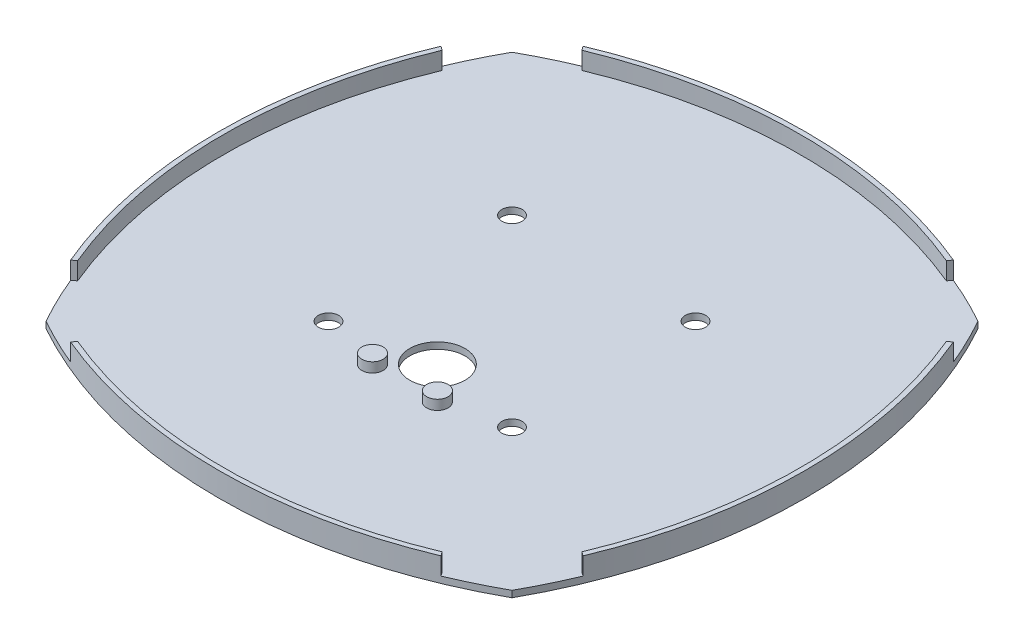
ISO-10303-21;
HEADER;
FILE_DESCRIPTION(('STEP AP214'),'2;1');
FILE_NAME('part.step','',(''),(''),'','','');
FILE_SCHEMA(('AUTOMOTIVE_DESIGN { 1 0 10303 214 1 1 1 1 }'));
ENDSEC;
DATA;
#1=APPLICATION_CONTEXT('core data for automotive mechanical design processes');
#2=APPLICATION_PROTOCOL_DEFINITION('international standard','automotive_design',2000,#1);
#3=PRODUCT_CONTEXT('',#1,'mechanical');
#4=PRODUCT('Part','Part','',(#3));
#5=PRODUCT_RELATED_PRODUCT_CATEGORY('part','',(#4));
#6=PRODUCT_DEFINITION_FORMATION('','',#4);
#7=PRODUCT_DEFINITION_CONTEXT('part definition',#1,'design');
#8=PRODUCT_DEFINITION('design','',#6,#7);
#9=PRODUCT_DEFINITION_SHAPE('','',#8);
#10=(LENGTH_UNIT() NAMED_UNIT(*) SI_UNIT(.MILLI.,.METRE.));
#11=(NAMED_UNIT(*) PLANE_ANGLE_UNIT() SI_UNIT($,.RADIAN.));
#12=(NAMED_UNIT(*) SI_UNIT($,.STERADIAN.) SOLID_ANGLE_UNIT());
#13=UNCERTAINTY_MEASURE_WITH_UNIT(LENGTH_MEASURE(1.E-05),#10,'distance_accuracy_value','');
#14=(GEOMETRIC_REPRESENTATION_CONTEXT(3) GLOBAL_UNCERTAINTY_ASSIGNED_CONTEXT((#13)) GLOBAL_UNIT_ASSIGNED_CONTEXT((#10,
#11,#12)) REPRESENTATION_CONTEXT('',''));
#15=CARTESIAN_POINT('',(0.,0.,0.));
#16=DIRECTION('',(0.,0.,1.));
#17=DIRECTION('',(1.,0.,0.));
#18=AXIS2_PLACEMENT_3D('',#15,#16,#17);
#19=CARTESIAN_POINT('',(170.576368521805,2.,81.6560053184627));
#20=DIRECTION('',(0.,1.,0.));
#21=DIRECTION('',(0.,0.,1.));
#22=AXIS2_PLACEMENT_3D('',#19,#20,#21);
#23=PLANE('',#22);
#24=CARTESIAN_POINT('',(209.331937645936,2.,85.9004361943316));
#25=DIRECTION('',(0.,1.,0.));
#26=DIRECTION('',(0.,0.,1.));
#27=AXIS2_PLACEMENT_3D('',#24,#25,#26);
#28=CIRCLE('',#27,3.28947250591846);
#29=CARTESIAN_POINT('',(209.331937645936,2.,89.1899087002501));
#30=VERTEX_POINT('',#29);
#31=EDGE_CURVE('E661',#30,#30,#28,.T.);
#32=ORIENTED_EDGE('',*,*,#31,.F.);
#33=EDGE_LOOP('',(#32));
#34=FACE_BOUND('',#33,.T.);
#35=CARTESIAN_POINT('',(189.331937645936,2.,85.9004361943316));
#36=DIRECTION('',(0.,1.,0.));
#37=DIRECTION('',(0.,0.,1.));
#38=AXIS2_PLACEMENT_3D('',#35,#36,#37);
#39=CIRCLE('',#38,3.28947250591846);
#40=CARTESIAN_POINT('',(189.331937645936,2.,89.1899087002501));
#41=VERTEX_POINT('',#40);
#42=EDGE_CURVE('E660',#41,#41,#39,.T.);
#43=ORIENTED_EDGE('',*,*,#42,.F.);
#44=EDGE_LOOP('',(#43));
#45=FACE_BOUND('',#44,.T.);
#46=CARTESIAN_POINT('',(199.331937645936,2.,75.9004361943316));
#47=DIRECTION('',(0.,1.,0.));
#48=DIRECTION('',(0.,0.,1.));
#49=AXIS2_PLACEMENT_3D('',#46,#47,#48);
#50=CIRCLE('',#49,8.50000000000001);
#51=CARTESIAN_POINT('',(199.331937645936,2.,84.4004361943316));
#52=VERTEX_POINT('',#51);
#53=EDGE_CURVE('E698',#52,#52,#50,.T.);
#54=ORIENTED_EDGE('',*,*,#53,.F.);
#55=EDGE_LOOP('',(#54));
#56=FACE_BOUND('',#55,.T.);
#57=CARTESIAN_POINT('',(227.616208893398,2.,24.6161649468689));
#58=DIRECTION('',(0.,1.,0.));
#59=DIRECTION('',(0.,0.,1.));
#60=AXIS2_PLACEMENT_3D('',#57,#58,#59);
#61=CIRCLE('',#60,3.15000000000001);
#62=CARTESIAN_POINT('',(227.616208893398,2.,27.7661649468689));
#63=VERTEX_POINT('',#62);
#64=EDGE_CURVE('E695',#63,#63,#61,.T.);
#65=ORIENTED_EDGE('',*,*,#64,.F.);
#66=EDGE_LOOP('',(#65));
#67=FACE_BOUND('',#66,.T.);
#68=CARTESIAN_POINT('',(227.616208893398,2.,81.1847074417927));
#69=DIRECTION('',(0.,1.,0.));
#70=DIRECTION('',(0.,0.,1.));
#71=AXIS2_PLACEMENT_3D('',#68,#69,#70);
#72=CIRCLE('',#71,3.15000000000001);
#73=CARTESIAN_POINT('',(227.616208893398,2.,84.3347074417927));
#74=VERTEX_POINT('',#73);
#75=EDGE_CURVE('E692',#74,#74,#72,.T.);
#76=ORIENTED_EDGE('',*,*,#75,.F.);
#77=EDGE_LOOP('',(#76));
#78=FACE_BOUND('',#77,.T.);
#79=CARTESIAN_POINT('',(171.047666398475,2.,81.1847074417936));
#80=DIRECTION('',(0.,1.,0.));
#81=DIRECTION('',(0.,0.,1.));
#82=AXIS2_PLACEMENT_3D('',#79,#80,#81);
#83=CIRCLE('',#82,3.15000000000001);
#84=CARTESIAN_POINT('',(171.047666398475,2.,84.3347074417936));
#85=VERTEX_POINT('',#84);
#86=EDGE_CURVE('E689',#85,#85,#83,.T.);
#87=ORIENTED_EDGE('',*,*,#86,.F.);
#88=EDGE_LOOP('',(#87));
#89=FACE_BOUND('',#88,.T.);
#90=CARTESIAN_POINT('',(171.047666398474,2.,24.6161649468698));
#91=DIRECTION('',(0.,1.,0.));
#92=DIRECTION('',(0.,0.,1.));
#93=AXIS2_PLACEMENT_3D('',#90,#91,#92);
#94=CIRCLE('',#93,3.15000000000001);
#95=CARTESIAN_POINT('',(171.047666398474,2.,27.7661649468698));
#96=VERTEX_POINT('',#95);
#97=EDGE_CURVE('E686',#96,#96,#94,.T.);
#98=ORIENTED_EDGE('',*,*,#97,.F.);
#99=EDGE_LOOP('',(#98));
#100=FACE_BOUND('',#99,.T.);
#101=CARTESIAN_POINT('',(199.331937645936,2.,110.411574442594));
#102=DIRECTION('',(0.,1.,0.));
#103=DIRECTION('',(0.,0.,1.));
#104=AXIS2_PLACEMENT_3D('',#101,#102,#103);
#105=CIRCLE('',#104,147.936802853876);
#106=CARTESIAN_POINT('',(271.153533244522,2.,-18.9211594042543));
#107=VERTEX_POINT('',#106);
#108=CARTESIAN_POINT('',(256.418033391832,2.,-26.0672712116573));
#109=VERTEX_POINT('',#108);
#110=EDGE_CURVE('E288',#107,#109,#105,.T.);
#111=ORIENTED_EDGE('',*,*,#110,.T.);
#112=DIRECTION('',(0.587785252292445,0.,-0.809016994374968));
#113=VECTOR('',#112,1.);
#114=CARTESIAN_POINT('',(255.511791015357,2.,-24.8199355891117));
#115=LINE('',#114,#113);
#116=CARTESIAN_POINT('',(255.511791015357,2.,-24.8199355891117));
#117=VERTEX_POINT('',#116);
#118=EDGE_CURVE('E48',#117,#109,#115,.T.);
#119=ORIENTED_EDGE('',*,*,#118,.F.);
#120=CARTESIAN_POINT('',(199.331937645936,2.,110.411574442594));
#121=DIRECTION('',(0.,-1.,0.));
#122=DIRECTION('',(0.,0.,1.));
#123=AXIS2_PLACEMENT_3D('',#120,#121,#122);
#124=CIRCLE('',#123,146.436802853876);
#125=CARTESIAN_POINT('',(143.149831373976,2.,-24.8189996333568));
#126=VERTEX_POINT('',#125);
#127=EDGE_CURVE('E53',#126,#117,#124,.T.);
#128=ORIENTED_EDGE('',*,*,#127,.F.);
#129=DIRECTION('',(0.587785252292468,0.,0.809016994374951));
#130=VECTOR('',#129,1.);
#131=CARTESIAN_POINT('',(143.149831373976,2.,-24.8189996333568));
#132=LINE('',#131,#130);
#133=CARTESIAN_POINT('',(142.243592566726,2.,-26.0663303432857));
#134=VERTEX_POINT('',#133);
#135=EDGE_CURVE('E188',#134,#126,#132,.T.);
#136=ORIENTED_EDGE('',*,*,#135,.F.);
#137=CARTESIAN_POINT('',(127.51034204735,2.,-18.9211594042545));
#138=VERTEX_POINT('',#137);
#139=EDGE_CURVE('E286',#134,#138,#105,.T.);
#140=ORIENTED_EDGE('',*,*,#139,.T.);
#141=CARTESIAN_POINT('',(256.843075894197,2.,52.9004361943318));
#142=DIRECTION('',(0.,1.,0.));
#143=DIRECTION('',(0.,0.,1.));
#144=AXIS2_PLACEMENT_3D('',#141,#142,#143);
#145=CIRCLE('',#144,147.936802853876);
#146=CARTESIAN_POINT('',(120.365171108318,2.,-4.18790888487821));
#147=VERTEX_POINT('',#146);
#148=EDGE_CURVE('E291',#138,#147,#145,.T.);
#149=ORIENTED_EDGE('',*,*,#148,.T.);
#150=DIRECTION('',(-0.809016994374947,0.,-0.587785252292473));
#151=VECTOR('',#150,1.);
#152=CARTESIAN_POINT('',(121.612501818247,2.,-3.28167007762777));
#153=LINE('',#152,#151);
#154=CARTESIAN_POINT('',(121.612501818247,2.,-3.28167007762776));
#155=VERTEX_POINT('',#154);
#156=EDGE_CURVE('E204',#155,#147,#153,.T.);
#157=ORIENTED_EDGE('',*,*,#156,.F.);
#158=CARTESIAN_POINT('',(256.843075894197,2.,52.9004361943318));
#159=DIRECTION('',(0.,-1.,0.));
#160=DIRECTION('',(0.,0.,1.));
#161=AXIS2_PLACEMENT_3D('',#158,#159,#160);
#162=CIRCLE('',#161,146.436802853876);
#163=CARTESIAN_POINT('',(121.611565862492,2.,109.080289563753));
#164=VERTEX_POINT('',#163);
#165=EDGE_CURVE('E194',#164,#155,#162,.T.);
#166=ORIENTED_EDGE('',*,*,#165,.F.);
#167=DIRECTION('',(0.809016994374951,0.,-0.587785252292469));
#168=VECTOR('',#167,1.);
#169=CARTESIAN_POINT('',(121.611565862492,2.,109.080289563753));
#170=LINE('',#169,#168);
#171=CARTESIAN_POINT('',(120.364230239947,2.,109.986531940228));
#172=VERTEX_POINT('',#171);
#173=EDGE_CURVE('E191',#172,#164,#170,.T.);
#174=ORIENTED_EDGE('',*,*,#173,.F.);
#175=CARTESIAN_POINT('',(127.510342047349,2.,124.722031792917));
#176=VERTEX_POINT('',#175);
#177=EDGE_CURVE('E290',#172,#176,#145,.T.);
#178=ORIENTED_EDGE('',*,*,#177,.T.);
#179=CARTESIAN_POINT('',(199.331937645936,2.,-4.61070205393033));
#180=DIRECTION('',(0.,1.,0.));
#181=DIRECTION('',(0.,0.,1.));
#182=AXIS2_PLACEMENT_3D('',#179,#180,#181);
#183=CIRCLE('',#182,147.936802853876);
#184=CARTESIAN_POINT('',(142.245841900039,2.,131.86814360032));
#185=VERTEX_POINT('',#184);
#186=EDGE_CURVE('E294',#176,#185,#183,.T.);
#187=ORIENTED_EDGE('',*,*,#186,.T.);
#188=DIRECTION('',(-0.587785252292465,0.,0.809016994374953));
#189=VECTOR('',#188,1.);
#190=CARTESIAN_POINT('',(143.152084276514,2.,130.620807977775));
#191=LINE('',#190,#189);
#192=CARTESIAN_POINT('',(143.152084276514,2.,130.620807977775));
#193=VERTEX_POINT('',#192);
#194=EDGE_CURVE('E266',#193,#185,#191,.T.);
#195=ORIENTED_EDGE('',*,*,#194,.F.);
#196=CARTESIAN_POINT('',(199.331937645936,2.,-4.61070205393033));
#197=DIRECTION('',(0.,-1.,0.));
#198=DIRECTION('',(0.,0.,1.));
#199=AXIS2_PLACEMENT_3D('',#196,#197,#198);
#200=CIRCLE('',#199,146.436802853876);
#201=CARTESIAN_POINT('',(255.511791015357,2.,130.620807977775));
#202=VERTEX_POINT('',#201);
#203=EDGE_CURVE('E252',#202,#193,#200,.T.);
#204=ORIENTED_EDGE('',*,*,#203,.F.);
#205=DIRECTION('',(-0.587785252292472,0.,-0.809016994374948));
#206=VECTOR('',#205,1.);
#207=CARTESIAN_POINT('',(255.511791015357,2.,130.620807977775));
#208=LINE('',#207,#206);
#209=CARTESIAN_POINT('',(256.418033391833,2.,131.868143600321));
#210=VERTEX_POINT('',#209);
#211=EDGE_CURVE('E257',#210,#202,#208,.T.);
#212=ORIENTED_EDGE('',*,*,#211,.F.);
#213=CARTESIAN_POINT('',(271.153533244522,2.,124.722031792918));
#214=VERTEX_POINT('',#213);
#215=EDGE_CURVE('E293',#210,#214,#183,.T.);
#216=ORIENTED_EDGE('',*,*,#215,.T.);
#217=CARTESIAN_POINT('',(141.820799397674,2.,52.9004361943319));
#218=DIRECTION('',(0.,1.,0.));
#219=DIRECTION('',(0.,0.,1.));
#220=AXIS2_PLACEMENT_3D('',#217,#218,#219);
#221=CIRCLE('',#220,147.936802853876);
#222=CARTESIAN_POINT('',(278.299645051925,2.,109.986531940229));
#223=VERTEX_POINT('',#222);
#224=EDGE_CURVE('E283',#214,#223,#221,.T.);
#225=ORIENTED_EDGE('',*,*,#224,.T.);
#226=DIRECTION('',(0.809016994374962,0.,0.587785252292454));
#227=VECTOR('',#226,1.);
#228=CARTESIAN_POINT('',(277.052309429379,2.,109.080289563753));
#229=LINE('',#228,#227);
#230=CARTESIAN_POINT('',(277.052309429379,2.,109.080289563753));
#231=VERTEX_POINT('',#230);
#232=EDGE_CURVE('E240',#231,#223,#229,.T.);
#233=ORIENTED_EDGE('',*,*,#232,.F.);
#234=CARTESIAN_POINT('',(141.820799397674,2.,52.9004361943319));
#235=DIRECTION('',(0.,-1.,0.));
#236=DIRECTION('',(0.,0.,1.));
#237=AXIS2_PLACEMENT_3D('',#234,#235,#236);
#238=CIRCLE('',#237,146.436802853876);
#239=CARTESIAN_POINT('',(277.052309429379,2.,-3.27941717508983));
#240=VERTEX_POINT('',#239);
#241=EDGE_CURVE('E226',#240,#231,#238,.T.);
#242=ORIENTED_EDGE('',*,*,#241,.F.);
#243=DIRECTION('',(-0.809016994374961,0.,0.587785252292454));
#244=VECTOR('',#243,1.);
#245=CARTESIAN_POINT('',(277.052309429379,2.,-3.27941717508983));
#246=LINE('',#245,#244);
#247=CARTESIAN_POINT('',(278.299645051925,2.,-4.1856595515652));
#248=VERTEX_POINT('',#247);
#249=EDGE_CURVE('E231',#248,#240,#246,.T.);
#250=ORIENTED_EDGE('',*,*,#249,.F.);
#251=EDGE_CURVE('E287',#248,#107,#221,.T.);
#252=ORIENTED_EDGE('',*,*,#251,.T.);
#253=EDGE_LOOP('',(#111,#119,#128,#136,#140,#149,#157,#166,#174,#178,#187,#195,#204,#212,#216,
#225,#233,#242,#250,#252));
#254=FACE_BOUND('',#253,.T.);
#255=ADVANCED_FACE('F33',(#34,#45,#56,#67,#78,#89,#100,#254),#23,.T.);
#256=CARTESIAN_POINT('',(141.820799397674,2.,52.9004361943319));
#257=DIRECTION('',(0.,-1.,0.));
#258=DIRECTION('',(0.,0.,-1.));
#259=AXIS2_PLACEMENT_3D('',#256,#257,#258);
#260=CYLINDRICAL_SURFACE('',#259,147.936802853876);
#261=CARTESIAN_POINT('',(141.820799397674,0.,52.9004361943319));
#262=DIRECTION('',(0.,1.,0.));
#263=DIRECTION('',(0.,0.,1.));
#264=AXIS2_PLACEMENT_3D('',#261,#262,#263);
#265=CIRCLE('',#264,147.936802853876);
#266=CARTESIAN_POINT('',(271.153533244522,0.,124.722031792918));
#267=VERTEX_POINT('',#266);
#268=CARTESIAN_POINT('',(271.153533244522,0.,-18.9211594042543));
#269=VERTEX_POINT('',#268);
#270=EDGE_CURVE('E282',#267,#269,#265,.T.);
#271=ORIENTED_EDGE('',*,*,#270,.T.);
#272=DIRECTION('',(0.,-1.,0.));
#273=VECTOR('',#272,1.);
#274=CARTESIAN_POINT('',(271.153533244522,2.,-18.9211594042543));
#275=LINE('',#274,#273);
#276=EDGE_CURVE('E11',#107,#269,#275,.T.);
#277=ORIENTED_EDGE('',*,*,#276,.F.);
#278=ORIENTED_EDGE('',*,*,#251,.F.);
#279=DIRECTION('',(0.,-1.,0.));
#280=VECTOR('',#279,1.);
#281=CARTESIAN_POINT('',(278.299645051925,7.4,-4.18565955156519));
#282=LINE('',#281,#280);
#283=CARTESIAN_POINT('',(278.299645051925,7.4,-4.18565955156519));
#284=VERTEX_POINT('',#283);
#285=EDGE_CURVE('E245',#284,#248,#282,.T.);
#286=ORIENTED_EDGE('',*,*,#285,.F.);
#287=CARTESIAN_POINT('',(141.820799397674,7.4,52.9004361943319));
#288=DIRECTION('',(0.,1.,0.));
#289=DIRECTION('',(0.,0.,1.));
#290=AXIS2_PLACEMENT_3D('',#287,#288,#289);
#291=CIRCLE('',#290,147.936802853876);
#292=CARTESIAN_POINT('',(278.299645051925,7.4,109.986531940229));
#293=VERTEX_POINT('',#292);
#294=EDGE_CURVE('E233',#293,#284,#291,.T.);
#295=ORIENTED_EDGE('',*,*,#294,.F.);
#296=DIRECTION('',(0.,-1.,0.));
#297=VECTOR('',#296,1.);
#298=CARTESIAN_POINT('',(278.299645051925,7.4,109.986531940229));
#299=LINE('',#298,#297);
#300=EDGE_CURVE('E247',#293,#223,#299,.T.);
#301=ORIENTED_EDGE('',*,*,#300,.T.);
#302=ORIENTED_EDGE('',*,*,#224,.F.);
#303=DIRECTION('',(0.,-1.,0.));
#304=VECTOR('',#303,1.);
#305=CARTESIAN_POINT('',(271.153533244522,2.,124.722031792918));
#306=LINE('',#305,#304);
#307=EDGE_CURVE('E296',#214,#267,#306,.T.);
#308=ORIENTED_EDGE('',*,*,#307,.T.);
#309=EDGE_LOOP('',(#271,#277,#278,#286,#295,#301,#302,#308));
#310=FACE_BOUND('',#309,.T.);
#311=ADVANCED_FACE('F35',(#310),#260,.T.);
#312=CARTESIAN_POINT('',(199.331937645936,2.,110.411574442594));
#313=DIRECTION('',(0.,-1.,0.));
#314=DIRECTION('',(0.,0.,-1.));
#315=AXIS2_PLACEMENT_3D('',#312,#313,#314);
#316=CYLINDRICAL_SURFACE('',#315,147.936802853876);
#317=CARTESIAN_POINT('',(199.331937645936,0.,110.411574442594));
#318=DIRECTION('',(0.,1.,0.));
#319=DIRECTION('',(0.,0.,1.));
#320=AXIS2_PLACEMENT_3D('',#317,#318,#319);
#321=CIRCLE('',#320,147.936802853876);
#322=CARTESIAN_POINT('',(127.51034204735,0.,-18.9211594042545));
#323=VERTEX_POINT('',#322);
#324=EDGE_CURVE('E299',#269,#323,#321,.T.);
#325=ORIENTED_EDGE('',*,*,#324,.T.);
#326=DIRECTION('',(0.,-1.,0.));
#327=VECTOR('',#326,1.);
#328=CARTESIAN_POINT('',(127.51034204735,2.,-18.9211594042545));
#329=LINE('',#328,#327);
#330=EDGE_CURVE('E41',#138,#323,#329,.T.);
#331=ORIENTED_EDGE('',*,*,#330,.F.);
#332=ORIENTED_EDGE('',*,*,#139,.F.);
#333=DIRECTION('',(0.,-1.,0.));
#334=VECTOR('',#333,1.);
#335=CARTESIAN_POINT('',(142.243592566726,7.4,-26.0663303432857));
#336=LINE('',#335,#334);
#337=CARTESIAN_POINT('',(142.243592566726,7.4,-26.0663303432857));
#338=VERTEX_POINT('',#337);
#339=EDGE_CURVE('E196',#338,#134,#336,.T.);
#340=ORIENTED_EDGE('',*,*,#339,.F.);
#341=CARTESIAN_POINT('',(199.331937645936,7.4,110.411574442594));
#342=DIRECTION('',(0.,1.,0.));
#343=DIRECTION('',(0.,0.,1.));
#344=AXIS2_PLACEMENT_3D('',#341,#342,#343);
#345=CIRCLE('',#344,147.936802853876);
#346=CARTESIAN_POINT('',(256.418033391832,7.4,-26.0672712116573));
#347=VERTEX_POINT('',#346);
#348=EDGE_CURVE('E178',#347,#338,#345,.T.);
#349=ORIENTED_EDGE('',*,*,#348,.F.);
#350=DIRECTION('',(0.,-1.,0.));
#351=VECTOR('',#350,1.);
#352=CARTESIAN_POINT('',(256.418033391832,7.4,-26.0672712116573));
#353=LINE('',#352,#351);
#354=EDGE_CURVE('E175',#347,#109,#353,.T.);
#355=ORIENTED_EDGE('',*,*,#354,.T.);
#356=ORIENTED_EDGE('',*,*,#110,.F.);
#357=ORIENTED_EDGE('',*,*,#276,.T.);
#358=EDGE_LOOP('',(#325,#331,#332,#340,#349,#355,#356,#357));
#359=FACE_BOUND('',#358,.T.);
#360=ADVANCED_FACE('F377',(#359),#316,.T.);
#361=CARTESIAN_POINT('',(256.843075894197,2.,52.9004361943318));
#362=DIRECTION('',(0.,-1.,0.));
#363=DIRECTION('',(0.,0.,-1.));
#364=AXIS2_PLACEMENT_3D('',#361,#362,#363);
#365=CYLINDRICAL_SURFACE('',#364,147.936802853876);
#366=CARTESIAN_POINT('',(256.843075894197,0.,52.9004361943318));
#367=DIRECTION('',(0.,1.,0.));
#368=DIRECTION('',(0.,0.,1.));
#369=AXIS2_PLACEMENT_3D('',#366,#367,#368);
#370=CIRCLE('',#369,147.936802853876);
#371=CARTESIAN_POINT('',(127.510342047349,0.,124.722031792917));
#372=VERTEX_POINT('',#371);
#373=EDGE_CURVE('E301',#323,#372,#370,.T.);
#374=ORIENTED_EDGE('',*,*,#373,.T.);
#375=DIRECTION('',(0.,-1.,0.));
#376=VECTOR('',#375,1.);
#377=CARTESIAN_POINT('',(127.510342047349,2.,124.722031792917));
#378=LINE('',#377,#376);
#379=EDGE_CURVE('E307',#176,#372,#378,.T.);
#380=ORIENTED_EDGE('',*,*,#379,.F.);
#381=ORIENTED_EDGE('',*,*,#177,.F.);
#382=DIRECTION('',(0.,-1.,0.));
#383=VECTOR('',#382,1.);
#384=CARTESIAN_POINT('',(120.364230239947,7.4,109.986531940228));
#385=LINE('',#384,#383);
#386=CARTESIAN_POINT('',(120.364230239947,7.4,109.986531940228));
#387=VERTEX_POINT('',#386);
#388=EDGE_CURVE('E223',#387,#172,#385,.T.);
#389=ORIENTED_EDGE('',*,*,#388,.F.);
#390=CARTESIAN_POINT('',(256.843075894197,7.4,52.9004361943318));
#391=DIRECTION('',(0.,1.,0.));
#392=DIRECTION('',(0.,0.,1.));
#393=AXIS2_PLACEMENT_3D('',#390,#391,#392);
#394=CIRCLE('',#393,147.936802853876);
#395=CARTESIAN_POINT('',(120.365171108318,7.4,-4.18790888487821));
#396=VERTEX_POINT('',#395);
#397=EDGE_CURVE('E200',#396,#387,#394,.T.);
#398=ORIENTED_EDGE('',*,*,#397,.F.);
#399=DIRECTION('',(0.,-1.,0.));
#400=VECTOR('',#399,1.);
#401=CARTESIAN_POINT('',(120.365171108318,7.4,-4.18790888487821));
#402=LINE('',#401,#400);
#403=EDGE_CURVE('E209',#396,#147,#402,.T.);
#404=ORIENTED_EDGE('',*,*,#403,.T.);
#405=ORIENTED_EDGE('',*,*,#148,.F.);
#406=ORIENTED_EDGE('',*,*,#330,.T.);
#407=EDGE_LOOP('',(#374,#380,#381,#389,#398,#404,#405,#406));
#408=FACE_BOUND('',#407,.T.);
#409=ADVANCED_FACE('F314',(#408),#365,.T.);
#410=CARTESIAN_POINT('',(199.331937645936,2.,-4.61070205393033));
#411=DIRECTION('',(0.,-1.,0.));
#412=DIRECTION('',(0.,0.,-1.));
#413=AXIS2_PLACEMENT_3D('',#410,#411,#412);
#414=CYLINDRICAL_SURFACE('',#413,147.936802853876);
#415=CARTESIAN_POINT('',(199.331937645936,0.,-4.61070205393033));
#416=DIRECTION('',(0.,1.,0.));
#417=DIRECTION('',(0.,0.,1.));
#418=AXIS2_PLACEMENT_3D('',#415,#416,#417);
#419=CIRCLE('',#418,147.936802853876);
#420=EDGE_CURVE('E303',#372,#267,#419,.T.);
#421=ORIENTED_EDGE('',*,*,#420,.T.);
#422=ORIENTED_EDGE('',*,*,#307,.F.);
#423=ORIENTED_EDGE('',*,*,#215,.F.);
#424=DIRECTION('',(0.,-1.,0.));
#425=VECTOR('',#424,1.);
#426=CARTESIAN_POINT('',(256.418033391833,7.4,131.868143600321));
#427=LINE('',#426,#425);
#428=CARTESIAN_POINT('',(256.418033391833,7.4,131.868143600321));
#429=VERTEX_POINT('',#428);
#430=EDGE_CURVE('E273',#429,#210,#427,.T.);
#431=ORIENTED_EDGE('',*,*,#430,.F.);
#432=CARTESIAN_POINT('',(199.331937645936,7.4,-4.61070205393033));
#433=DIRECTION('',(0.,1.,0.));
#434=DIRECTION('',(0.,0.,1.));
#435=AXIS2_PLACEMENT_3D('',#432,#433,#434);
#436=CIRCLE('',#435,147.936802853876);
#437=CARTESIAN_POINT('',(142.245841900039,7.4,131.86814360032));
#438=VERTEX_POINT('',#437);
#439=EDGE_CURVE('E259',#438,#429,#436,.T.);
#440=ORIENTED_EDGE('',*,*,#439,.F.);
#441=DIRECTION('',(0.,-1.,0.));
#442=VECTOR('',#441,1.);
#443=CARTESIAN_POINT('',(142.245841900039,7.4,131.86814360032));
#444=LINE('',#443,#442);
#445=EDGE_CURVE('E276',#438,#185,#444,.T.);
#446=ORIENTED_EDGE('',*,*,#445,.T.);
#447=ORIENTED_EDGE('',*,*,#186,.F.);
#448=ORIENTED_EDGE('',*,*,#379,.T.);
#449=EDGE_LOOP('',(#421,#422,#423,#431,#440,#446,#447,#448));
#450=FACE_BOUND('',#449,.T.);
#451=ADVANCED_FACE('F323',(#450),#414,.T.);
#452=CARTESIAN_POINT('',(170.576368521805,0.,81.6560053184627));
#453=DIRECTION('',(0.,1.,0.));
#454=DIRECTION('',(0.,0.,1.));
#455=AXIS2_PLACEMENT_3D('',#452,#453,#454);
#456=PLANE('',#455);
#457=CARTESIAN_POINT('',(199.331937645936,0.,75.9004361943316));
#458=DIRECTION('',(0.,1.,0.));
#459=DIRECTION('',(0.,0.,1.));
#460=AXIS2_PLACEMENT_3D('',#457,#458,#459);
#461=CIRCLE('',#460,8.50000000000001);
#462=CARTESIAN_POINT('',(199.331937645936,0.,84.4004361943316));
#463=VERTEX_POINT('',#462);
#464=EDGE_CURVE('E678',#463,#463,#461,.T.);
#465=ORIENTED_EDGE('',*,*,#464,.T.);
#466=EDGE_LOOP('',(#465));
#467=FACE_BOUND('',#466,.T.);
#468=CARTESIAN_POINT('',(227.616208893398,0.,24.6161649468689));
#469=DIRECTION('',(0.,1.,0.));
#470=DIRECTION('',(0.,0.,1.));
#471=AXIS2_PLACEMENT_3D('',#468,#469,#470);
#472=CIRCLE('',#471,3.15000000000001);
#473=CARTESIAN_POINT('',(227.616208893398,0.,27.7661649468689));
#474=VERTEX_POINT('',#473);
#475=EDGE_CURVE('E675',#474,#474,#472,.T.);
#476=ORIENTED_EDGE('',*,*,#475,.T.);
#477=EDGE_LOOP('',(#476));
#478=FACE_BOUND('',#477,.T.);
#479=CARTESIAN_POINT('',(227.616208893398,0.,81.1847074417927));
#480=DIRECTION('',(0.,1.,0.));
#481=DIRECTION('',(0.,0.,1.));
#482=AXIS2_PLACEMENT_3D('',#479,#480,#481);
#483=CIRCLE('',#482,3.15000000000001);
#484=CARTESIAN_POINT('',(227.616208893398,0.,84.3347074417927));
#485=VERTEX_POINT('',#484);
#486=EDGE_CURVE('E672',#485,#485,#483,.T.);
#487=ORIENTED_EDGE('',*,*,#486,.T.);
#488=EDGE_LOOP('',(#487));
#489=FACE_BOUND('',#488,.T.);
#490=CARTESIAN_POINT('',(171.047666398475,0.,81.1847074417936));
#491=DIRECTION('',(0.,1.,0.));
#492=DIRECTION('',(0.,0.,1.));
#493=AXIS2_PLACEMENT_3D('',#490,#491,#492);
#494=CIRCLE('',#493,3.15000000000001);
#495=CARTESIAN_POINT('',(171.047666398475,0.,84.3347074417936));
#496=VERTEX_POINT('',#495);
#497=EDGE_CURVE('E670',#496,#496,#494,.T.);
#498=ORIENTED_EDGE('',*,*,#497,.T.);
#499=EDGE_LOOP('',(#498));
#500=FACE_BOUND('',#499,.T.);
#501=CARTESIAN_POINT('',(171.047666398474,0.,24.6161649468698));
#502=DIRECTION('',(0.,1.,0.));
#503=DIRECTION('',(0.,0.,1.));
#504=AXIS2_PLACEMENT_3D('',#501,#502,#503);
#505=CIRCLE('',#504,3.15000000000001);
#506=CARTESIAN_POINT('',(171.047666398474,0.,27.7661649468698));
#507=VERTEX_POINT('',#506);
#508=EDGE_CURVE('E681',#507,#507,#505,.T.);
#509=ORIENTED_EDGE('',*,*,#508,.T.);
#510=EDGE_LOOP('',(#509));
#511=FACE_BOUND('',#510,.T.);
#512=ORIENTED_EDGE('',*,*,#270,.F.);
#513=ORIENTED_EDGE('',*,*,#420,.F.);
#514=ORIENTED_EDGE('',*,*,#373,.F.);
#515=ORIENTED_EDGE('',*,*,#324,.F.);
#516=EDGE_LOOP('',(#512,#513,#514,#515));
#517=FACE_BOUND('',#516,.T.);
#518=ADVANCED_FACE('F320',(#467,#478,#489,#500,#511,#517),#456,.F.);
#519=CARTESIAN_POINT('',(199.331937645936,7.4,-4.61070205393033));
#520=DIRECTION('',(0.,-1.,0.));
#521=DIRECTION('',(0.,0.,-1.));
#522=AXIS2_PLACEMENT_3D('',#519,#520,#521);
#523=CYLINDRICAL_SURFACE('',#522,146.436802853876);
#524=ORIENTED_EDGE('',*,*,#203,.T.);
#525=DIRECTION('',(0.,-1.,0.));
#526=VECTOR('',#525,1.);
#527=CARTESIAN_POINT('',(143.152084276514,7.4,130.620807977775));
#528=LINE('',#527,#526);
#529=CARTESIAN_POINT('',(143.152084276514,7.4,130.620807977775));
#530=VERTEX_POINT('',#529);
#531=EDGE_CURVE('E279',#530,#193,#528,.T.);
#532=ORIENTED_EDGE('',*,*,#531,.F.);
#533=CARTESIAN_POINT('',(199.331937645936,7.4,-4.61070205393033));
#534=DIRECTION('',(0.,-1.,0.));
#535=DIRECTION('',(0.,0.,1.));
#536=AXIS2_PLACEMENT_3D('',#533,#534,#535);
#537=CIRCLE('',#536,146.436802853876);
#538=CARTESIAN_POINT('',(255.511791015357,7.4,130.620807977775));
#539=VERTEX_POINT('',#538);
#540=EDGE_CURVE('E253',#539,#530,#537,.T.);
#541=ORIENTED_EDGE('',*,*,#540,.F.);
#542=DIRECTION('',(0.,-1.,0.));
#543=VECTOR('',#542,1.);
#544=CARTESIAN_POINT('',(255.511791015357,7.4,130.620807977775));
#545=LINE('',#544,#543);
#546=EDGE_CURVE('E263',#539,#202,#545,.T.);
#547=ORIENTED_EDGE('',*,*,#546,.T.);
#548=EDGE_LOOP('',(#524,#532,#541,#547));
#549=FACE_BOUND('',#548,.T.);
#550=ADVANCED_FACE('F382',(#549),#523,.F.);
#551=CARTESIAN_POINT('',(143.152084276514,7.4,130.620807977775));
#552=DIRECTION('',(0.809016994374953,0.,0.587785252292465));
#553=DIRECTION('',(0.587785252292465,0.,-0.809016994374953));
#554=AXIS2_PLACEMENT_3D('',#551,#552,#553);
#555=PLANE('',#554);
#556=ORIENTED_EDGE('',*,*,#194,.T.);
#557=ORIENTED_EDGE('',*,*,#445,.F.);
#558=DIRECTION('',(-0.587785252292465,0.,0.809016994374953));
#559=VECTOR('',#558,1.);
#560=CARTESIAN_POINT('',(143.152084276514,7.4,130.620807977775));
#561=LINE('',#560,#559);
#562=EDGE_CURVE('E256',#530,#438,#561,.T.);
#563=ORIENTED_EDGE('',*,*,#562,.F.);
#564=ORIENTED_EDGE('',*,*,#531,.T.);
#565=EDGE_LOOP('',(#556,#557,#563,#564));
#566=FACE_BOUND('',#565,.T.);
#567=ADVANCED_FACE('F345',(#566),#555,.F.);
#568=CARTESIAN_POINT('',(255.511791015357,7.4,130.620807977775));
#569=DIRECTION('',(-0.809016994374948,0.,0.587785252292472));
#570=DIRECTION('',(0.587785252292472,0.,0.809016994374949));
#571=AXIS2_PLACEMENT_3D('',#568,#569,#570);
#572=PLANE('',#571);
#573=ORIENTED_EDGE('',*,*,#211,.T.);
#574=ORIENTED_EDGE('',*,*,#546,.F.);
#575=DIRECTION('',(-0.587785252292472,0.,-0.809016994374948));
#576=VECTOR('',#575,1.);
#577=CARTESIAN_POINT('',(255.511791015357,7.4,130.620807977775));
#578=LINE('',#577,#576);
#579=EDGE_CURVE('E261',#429,#539,#578,.T.);
#580=ORIENTED_EDGE('',*,*,#579,.F.);
#581=ORIENTED_EDGE('',*,*,#430,.T.);
#582=EDGE_LOOP('',(#573,#574,#580,#581));
#583=FACE_BOUND('',#582,.T.);
#584=ADVANCED_FACE('F337',(#583),#572,.F.);
#585=CARTESIAN_POINT('',(199.331937645936,7.4,-4.61070205393033));
#586=DIRECTION('',(0.,1.,0.));
#587=DIRECTION('',(0.,0.,1.));
#588=AXIS2_PLACEMENT_3D('',#585,#586,#587);
#589=PLANE('',#588);
#590=ORIENTED_EDGE('',*,*,#540,.T.);
#591=ORIENTED_EDGE('',*,*,#562,.T.);
#592=ORIENTED_EDGE('',*,*,#439,.T.);
#593=ORIENTED_EDGE('',*,*,#579,.T.);
#594=EDGE_LOOP('',(#590,#591,#592,#593));
#595=FACE_BOUND('',#594,.T.);
#596=ADVANCED_FACE('F341',(#595),#589,.T.);
#597=CARTESIAN_POINT('',(141.820799397674,7.4,52.9004361943319));
#598=DIRECTION('',(0.,-1.,0.));
#599=DIRECTION('',(0.,0.,-1.));
#600=AXIS2_PLACEMENT_3D('',#597,#598,#599);
#601=CYLINDRICAL_SURFACE('',#600,146.436802853876);
#602=ORIENTED_EDGE('',*,*,#241,.T.);
#603=DIRECTION('',(0.,-1.,0.));
#604=VECTOR('',#603,1.);
#605=CARTESIAN_POINT('',(277.052309429379,7.4,109.080289563753));
#606=LINE('',#605,#604);
#607=CARTESIAN_POINT('',(277.052309429379,7.4,109.080289563753));
#608=VERTEX_POINT('',#607);
#609=EDGE_CURVE('E250',#608,#231,#606,.T.);
#610=ORIENTED_EDGE('',*,*,#609,.F.);
#611=CARTESIAN_POINT('',(141.820799397674,7.4,52.9004361943319));
#612=DIRECTION('',(0.,-1.,0.));
#613=DIRECTION('',(0.,0.,1.));
#614=AXIS2_PLACEMENT_3D('',#611,#612,#613);
#615=CIRCLE('',#614,146.436802853876);
#616=CARTESIAN_POINT('',(277.052309429379,7.4,-3.27941717508983));
#617=VERTEX_POINT('',#616);
#618=EDGE_CURVE('E227',#617,#608,#615,.T.);
#619=ORIENTED_EDGE('',*,*,#618,.F.);
#620=DIRECTION('',(0.,-1.,0.));
#621=VECTOR('',#620,1.);
#622=CARTESIAN_POINT('',(277.052309429379,7.4,-3.27941717508983));
#623=LINE('',#622,#621);
#624=EDGE_CURVE('E237',#617,#240,#623,.T.);
#625=ORIENTED_EDGE('',*,*,#624,.T.);
#626=EDGE_LOOP('',(#602,#610,#619,#625));
#627=FACE_BOUND('',#626,.T.);
#628=ADVANCED_FACE('F403',(#627),#601,.F.);
#629=CARTESIAN_POINT('',(277.052309429379,7.4,109.080289563753));
#630=DIRECTION('',(0.587785252292453,0.,-0.809016994374962));
#631=DIRECTION('',(-0.809016994374962,0.,-0.587785252292454));
#632=AXIS2_PLACEMENT_3D('',#629,#630,#631);
#633=PLANE('',#632);
#634=ORIENTED_EDGE('',*,*,#232,.T.);
#635=ORIENTED_EDGE('',*,*,#300,.F.);
#636=DIRECTION('',(0.809016994374962,0.,0.587785252292454));
#637=VECTOR('',#636,1.);
#638=CARTESIAN_POINT('',(277.052309429379,7.4,109.080289563753));
#639=LINE('',#638,#637);
#640=EDGE_CURVE('E230',#608,#293,#639,.T.);
#641=ORIENTED_EDGE('',*,*,#640,.F.);
#642=ORIENTED_EDGE('',*,*,#609,.T.);
#643=EDGE_LOOP('',(#634,#635,#641,#642));
#644=FACE_BOUND('',#643,.T.);
#645=ADVANCED_FACE('F407',(#644),#633,.F.);
#646=CARTESIAN_POINT('',(277.052309429379,7.4,-3.27941717508983));
#647=DIRECTION('',(0.587785252292454,0.,0.809016994374961));
#648=DIRECTION('',(0.809016994374961,0.,-0.587785252292454));
#649=AXIS2_PLACEMENT_3D('',#646,#647,#648);
#650=PLANE('',#649);
#651=ORIENTED_EDGE('',*,*,#249,.T.);
#652=ORIENTED_EDGE('',*,*,#624,.F.);
#653=DIRECTION('',(-0.809016994374961,0.,0.587785252292454));
#654=VECTOR('',#653,1.);
#655=CARTESIAN_POINT('',(277.052309429379,7.4,-3.27941717508983));
#656=LINE('',#655,#654);
#657=EDGE_CURVE('E235',#284,#617,#656,.T.);
#658=ORIENTED_EDGE('',*,*,#657,.F.);
#659=ORIENTED_EDGE('',*,*,#285,.T.);
#660=EDGE_LOOP('',(#651,#652,#658,#659));
#661=FACE_BOUND('',#660,.T.);
#662=ADVANCED_FACE('F400',(#661),#650,.F.);
#663=CARTESIAN_POINT('',(141.820799397674,7.4,52.9004361943319));
#664=DIRECTION('',(0.,1.,0.));
#665=DIRECTION('',(0.,0.,1.));
#666=AXIS2_PLACEMENT_3D('',#663,#664,#665);
#667=PLANE('',#666);
#668=ORIENTED_EDGE('',*,*,#618,.T.);
#669=ORIENTED_EDGE('',*,*,#640,.T.);
#670=ORIENTED_EDGE('',*,*,#294,.T.);
#671=ORIENTED_EDGE('',*,*,#657,.T.);
#672=EDGE_LOOP('',(#668,#669,#670,#671));
#673=FACE_BOUND('',#672,.T.);
#674=ADVANCED_FACE('F369',(#673),#667,.T.);
#675=CARTESIAN_POINT('',(121.611565862492,7.4,109.080289563753));
#676=DIRECTION('',(-0.587785252292469,0.,-0.809016994374951));
#677=DIRECTION('',(-0.809016994374951,0.,0.587785252292469));
#678=AXIS2_PLACEMENT_3D('',#675,#676,#677);
#679=PLANE('',#678);
#680=ORIENTED_EDGE('',*,*,#173,.T.);
#681=DIRECTION('',(0.,-1.,0.));
#682=VECTOR('',#681,1.);
#683=CARTESIAN_POINT('',(121.611565862492,7.4,109.080289563753));
#684=LINE('',#683,#682);
#685=CARTESIAN_POINT('',(121.611565862492,7.4,109.080289563753));
#686=VERTEX_POINT('',#685);
#687=EDGE_CURVE('E220',#686,#164,#684,.T.);
#688=ORIENTED_EDGE('',*,*,#687,.F.);
#689=DIRECTION('',(0.809016994374951,0.,-0.587785252292469));
#690=VECTOR('',#689,1.);
#691=CARTESIAN_POINT('',(121.611565862492,7.4,109.080289563753));
#692=LINE('',#691,#690);
#693=EDGE_CURVE('E203',#387,#686,#692,.T.);
#694=ORIENTED_EDGE('',*,*,#693,.F.);
#695=ORIENTED_EDGE('',*,*,#388,.T.);
#696=EDGE_LOOP('',(#680,#688,#694,#695));
#697=FACE_BOUND('',#696,.T.);
#698=ADVANCED_FACE('F350',(#697),#679,.F.);
#699=CARTESIAN_POINT('',(256.843075894197,7.4,52.9004361943318));
#700=DIRECTION('',(0.,-1.,0.));
#701=DIRECTION('',(0.,0.,-1.));
#702=AXIS2_PLACEMENT_3D('',#699,#700,#701);
#703=CYLINDRICAL_SURFACE('',#702,146.436802853876);
#704=ORIENTED_EDGE('',*,*,#165,.T.);
#705=DIRECTION('',(0.,-1.,0.));
#706=VECTOR('',#705,1.);
#707=CARTESIAN_POINT('',(121.612501818247,7.4,-3.28167007762777));
#708=LINE('',#707,#706);
#709=CARTESIAN_POINT('',(121.612501818247,7.4,-3.28167007762777));
#710=VERTEX_POINT('',#709);
#711=EDGE_CURVE('E217',#710,#155,#708,.T.);
#712=ORIENTED_EDGE('',*,*,#711,.F.);
#713=CARTESIAN_POINT('',(256.843075894197,7.4,52.9004361943318));
#714=DIRECTION('',(0.,-1.,0.));
#715=DIRECTION('',(0.,0.,1.));
#716=AXIS2_PLACEMENT_3D('',#713,#714,#715);
#717=CIRCLE('',#716,146.436802853876);
#718=EDGE_CURVE('E206',#686,#710,#717,.T.);
#719=ORIENTED_EDGE('',*,*,#718,.F.);
#720=ORIENTED_EDGE('',*,*,#687,.T.);
#721=EDGE_LOOP('',(#704,#712,#719,#720));
#722=FACE_BOUND('',#721,.T.);
#723=ADVANCED_FACE('F361',(#722),#703,.F.);
#724=CARTESIAN_POINT('',(121.612501818247,7.4,-3.28167007762777));
#725=DIRECTION('',(-0.587785252292473,0.,0.809016994374947));
#726=DIRECTION('',(0.809016994374947,0.,0.587785252292473));
#727=AXIS2_PLACEMENT_3D('',#724,#725,#726);
#728=PLANE('',#727);
#729=ORIENTED_EDGE('',*,*,#156,.T.);
#730=ORIENTED_EDGE('',*,*,#403,.F.);
#731=DIRECTION('',(-0.809016994374947,0.,-0.587785252292473));
#732=VECTOR('',#731,1.);
#733=CARTESIAN_POINT('',(121.612501818247,7.4,-3.28167007762777));
#734=LINE('',#733,#732);
#735=EDGE_CURVE('E208',#710,#396,#734,.T.);
#736=ORIENTED_EDGE('',*,*,#735,.F.);
#737=ORIENTED_EDGE('',*,*,#711,.T.);
#738=EDGE_LOOP('',(#729,#730,#736,#737));
#739=FACE_BOUND('',#738,.T.);
#740=ADVANCED_FACE('F359',(#739),#728,.F.);
#741=CARTESIAN_POINT('',(256.843075894197,7.4,52.9004361943318));
#742=DIRECTION('',(0.,1.,0.));
#743=DIRECTION('',(0.,0.,1.));
#744=AXIS2_PLACEMENT_3D('',#741,#742,#743);
#745=PLANE('',#744);
#746=ORIENTED_EDGE('',*,*,#397,.T.);
#747=ORIENTED_EDGE('',*,*,#693,.T.);
#748=ORIENTED_EDGE('',*,*,#718,.T.);
#749=ORIENTED_EDGE('',*,*,#735,.T.);
#750=EDGE_LOOP('',(#746,#747,#748,#749));
#751=FACE_BOUND('',#750,.T.);
#752=ADVANCED_FACE('F354',(#751),#745,.T.);
#753=CARTESIAN_POINT('',(199.331937645936,7.4,110.411574442594));
#754=DIRECTION('',(0.,-1.,0.));
#755=DIRECTION('',(0.,0.,-1.));
#756=AXIS2_PLACEMENT_3D('',#753,#754,#755);
#757=CYLINDRICAL_SURFACE('',#756,146.436802853876);
#758=ORIENTED_EDGE('',*,*,#127,.T.);
#759=DIRECTION('',(0.,-1.,0.));
#760=VECTOR('',#759,1.);
#761=CARTESIAN_POINT('',(255.511791015357,7.4,-24.8199355891117));
#762=LINE('',#761,#760);
#763=CARTESIAN_POINT('',(255.511791015357,7.4,-24.8199355891117));
#764=VERTEX_POINT('',#763);
#765=EDGE_CURVE('E173',#764,#117,#762,.T.);
#766=ORIENTED_EDGE('',*,*,#765,.F.);
#767=CARTESIAN_POINT('',(199.331937645936,7.4,110.411574442594));
#768=DIRECTION('',(0.,-1.,0.));
#769=DIRECTION('',(0.,0.,1.));
#770=AXIS2_PLACEMENT_3D('',#767,#768,#769);
#771=CIRCLE('',#770,146.436802853876);
#772=CARTESIAN_POINT('',(143.149831373976,7.4,-24.8189996333568));
#773=VERTEX_POINT('',#772);
#774=EDGE_CURVE('E179',#773,#764,#771,.T.);
#775=ORIENTED_EDGE('',*,*,#774,.F.);
#776=DIRECTION('',(0.,-1.,0.));
#777=VECTOR('',#776,1.);
#778=CARTESIAN_POINT('',(143.149831373976,7.4,-24.8189996333568));
#779=LINE('',#778,#777);
#780=EDGE_CURVE('E703',#773,#126,#779,.T.);
#781=ORIENTED_EDGE('',*,*,#780,.T.);
#782=EDGE_LOOP('',(#758,#766,#775,#781));
#783=FACE_BOUND('',#782,.T.);
#784=ADVANCED_FACE('F190',(#783),#757,.F.);
#785=CARTESIAN_POINT('',(255.511791015357,7.4,-24.8199355891117));
#786=DIRECTION('',(-0.809016994374968,0.,-0.587785252292445));
#787=DIRECTION('',(-0.587785252292445,0.,0.809016994374968));
#788=AXIS2_PLACEMENT_3D('',#785,#786,#787);
#789=PLANE('',#788);
#790=ORIENTED_EDGE('',*,*,#118,.T.);
#791=ORIENTED_EDGE('',*,*,#354,.F.);
#792=DIRECTION('',(0.587785252292445,0.,-0.809016994374968));
#793=VECTOR('',#792,1.);
#794=CARTESIAN_POINT('',(255.511791015357,7.4,-24.8199355891117));
#795=LINE('',#794,#793);
#796=EDGE_CURVE('E169',#764,#347,#795,.T.);
#797=ORIENTED_EDGE('',*,*,#796,.F.);
#798=ORIENTED_EDGE('',*,*,#765,.T.);
#799=EDGE_LOOP('',(#790,#791,#797,#798));
#800=FACE_BOUND('',#799,.T.);
#801=ADVANCED_FACE('F171',(#800),#789,.F.);
#802=CARTESIAN_POINT('',(143.149831373976,7.4,-24.8189996333568));
#803=DIRECTION('',(0.809016994374951,0.,-0.587785252292468));
#804=DIRECTION('',(-0.587785252292468,0.,-0.809016994374951));
#805=AXIS2_PLACEMENT_3D('',#802,#803,#804);
#806=PLANE('',#805);
#807=ORIENTED_EDGE('',*,*,#135,.T.);
#808=ORIENTED_EDGE('',*,*,#780,.F.);
#809=DIRECTION('',(0.587785252292468,0.,0.809016994374951));
#810=VECTOR('',#809,1.);
#811=CARTESIAN_POINT('',(143.149831373976,7.4,-24.8189996333568));
#812=LINE('',#811,#810);
#813=EDGE_CURVE('E184',#338,#773,#812,.T.);
#814=ORIENTED_EDGE('',*,*,#813,.F.);
#815=ORIENTED_EDGE('',*,*,#339,.T.);
#816=EDGE_LOOP('',(#807,#808,#814,#815));
#817=FACE_BOUND('',#816,.T.);
#818=ADVANCED_FACE('F548',(#817),#806,.F.);
#819=CARTESIAN_POINT('',(199.331937645936,7.4,110.411574442594));
#820=DIRECTION('',(0.,1.,0.));
#821=DIRECTION('',(0.,0.,1.));
#822=AXIS2_PLACEMENT_3D('',#819,#820,#821);
#823=PLANE('',#822);
#824=ORIENTED_EDGE('',*,*,#774,.T.);
#825=ORIENTED_EDGE('',*,*,#796,.T.);
#826=ORIENTED_EDGE('',*,*,#348,.T.);
#827=ORIENTED_EDGE('',*,*,#813,.T.);
#828=EDGE_LOOP('',(#824,#825,#826,#827));
#829=FACE_BOUND('',#828,.T.);
#830=ADVANCED_FACE('F182',(#829),#823,.T.);
#831=CARTESIAN_POINT('',(171.047666398474,0.,24.6161649468698));
#832=DIRECTION('',(0.,1.,0.));
#833=DIRECTION('',(0.,0.,1.));
#834=AXIS2_PLACEMENT_3D('',#831,#832,#833);
#835=CYLINDRICAL_SURFACE('',#834,3.15000000000001);
#836=ORIENTED_EDGE('',*,*,#97,.T.);
#837=EDGE_LOOP('',(#836));
#838=FACE_BOUND('',#837,.T.);
#839=ORIENTED_EDGE('',*,*,#508,.F.);
#840=EDGE_LOOP('',(#839));
#841=FACE_BOUND('',#840,.T.);
#842=ADVANCED_FACE('F563',(#838,#841),#835,.F.);
#843=CARTESIAN_POINT('',(171.047666398475,0.,81.1847074417936));
#844=DIRECTION('',(0.,1.,0.));
#845=DIRECTION('',(0.,0.,1.));
#846=AXIS2_PLACEMENT_3D('',#843,#844,#845);
#847=CYLINDRICAL_SURFACE('',#846,3.15000000000001);
#848=ORIENTED_EDGE('',*,*,#86,.T.);
#849=EDGE_LOOP('',(#848));
#850=FACE_BOUND('',#849,.T.);
#851=ORIENTED_EDGE('',*,*,#497,.F.);
#852=EDGE_LOOP('',(#851));
#853=FACE_BOUND('',#852,.T.);
#854=ADVANCED_FACE('F570',(#850,#853),#847,.F.);
#855=CARTESIAN_POINT('',(227.616208893398,0.,81.1847074417927));
#856=DIRECTION('',(0.,1.,0.));
#857=DIRECTION('',(0.,0.,1.));
#858=AXIS2_PLACEMENT_3D('',#855,#856,#857);
#859=CYLINDRICAL_SURFACE('',#858,3.15000000000001);
#860=ORIENTED_EDGE('',*,*,#75,.T.);
#861=EDGE_LOOP('',(#860));
#862=FACE_BOUND('',#861,.T.);
#863=ORIENTED_EDGE('',*,*,#486,.F.);
#864=EDGE_LOOP('',(#863));
#865=FACE_BOUND('',#864,.T.);
#866=ADVANCED_FACE('F579',(#862,#865),#859,.F.);
#867=CARTESIAN_POINT('',(227.616208893398,0.,24.6161649468689));
#868=DIRECTION('',(0.,1.,0.));
#869=DIRECTION('',(0.,0.,1.));
#870=AXIS2_PLACEMENT_3D('',#867,#868,#869);
#871=CYLINDRICAL_SURFACE('',#870,3.15000000000001);
#872=ORIENTED_EDGE('',*,*,#64,.T.);
#873=EDGE_LOOP('',(#872));
#874=FACE_BOUND('',#873,.T.);
#875=ORIENTED_EDGE('',*,*,#475,.F.);
#876=EDGE_LOOP('',(#875));
#877=FACE_BOUND('',#876,.T.);
#878=ADVANCED_FACE('F588',(#874,#877),#871,.F.);
#879=CARTESIAN_POINT('',(199.331937645936,0.,75.9004361943316));
#880=DIRECTION('',(0.,1.,0.));
#881=DIRECTION('',(0.,0.,1.));
#882=AXIS2_PLACEMENT_3D('',#879,#880,#881);
#883=CYLINDRICAL_SURFACE('',#882,8.50000000000001);
#884=ORIENTED_EDGE('',*,*,#53,.T.);
#885=EDGE_LOOP('',(#884));
#886=FACE_BOUND('',#885,.T.);
#887=ORIENTED_EDGE('',*,*,#464,.F.);
#888=EDGE_LOOP('',(#887));
#889=FACE_BOUND('',#888,.T.);
#890=ADVANCED_FACE('F597',(#886,#889),#883,.F.);
#891=CARTESIAN_POINT('',(189.331937645936,5.,85.9004361943316));
#892=DIRECTION('',(0.,-1.,0.));
#893=DIRECTION('',(0.,0.,-1.));
#894=AXIS2_PLACEMENT_3D('',#891,#892,#893);
#895=CYLINDRICAL_SURFACE('',#894,3.28947250591846);
#896=CARTESIAN_POINT('',(189.331937645936,5.,85.9004361943316));
#897=DIRECTION('',(0.,1.,0.));
#898=DIRECTION('',(0.,0.,1.));
#899=AXIS2_PLACEMENT_3D('',#896,#897,#898);
#900=CIRCLE('',#899,3.28947250591846);
#901=CARTESIAN_POINT('',(189.331937645936,5.,89.1899087002501));
#902=VERTEX_POINT('',#901);
#903=EDGE_CURVE('E664',#902,#902,#900,.T.);
#904=ORIENTED_EDGE('',*,*,#903,.F.);
#905=EDGE_LOOP('',(#904));
#906=FACE_BOUND('',#905,.T.);
#907=ORIENTED_EDGE('',*,*,#42,.T.);
#908=EDGE_LOOP('',(#907));
#909=FACE_BOUND('',#908,.T.);
#910=ADVANCED_FACE('F605',(#906,#909),#895,.T.);
#911=CARTESIAN_POINT('',(189.331937645936,5.,85.9004361943316));
#912=DIRECTION('',(0.,1.,0.));
#913=DIRECTION('',(0.,0.,1.));
#914=AXIS2_PLACEMENT_3D('',#911,#912,#913);
#915=PLANE('',#914);
#916=ORIENTED_EDGE('',*,*,#903,.T.);
#917=EDGE_LOOP('',(#916));
#918=FACE_BOUND('',#917,.T.);
#919=ADVANCED_FACE('F613',(#918),#915,.T.);
#920=CARTESIAN_POINT('',(209.331937645936,5.,85.9004361943316));
#921=DIRECTION('',(0.,-1.,0.));
#922=DIRECTION('',(0.,0.,-1.));
#923=AXIS2_PLACEMENT_3D('',#920,#921,#922);
#924=CYLINDRICAL_SURFACE('',#923,3.28947250591846);
#925=CARTESIAN_POINT('',(209.331937645936,5.,85.9004361943316));
#926=DIRECTION('',(0.,1.,0.));
#927=DIRECTION('',(0.,0.,1.));
#928=AXIS2_PLACEMENT_3D('',#925,#926,#927);
#929=CIRCLE('',#928,3.28947250591846);
#930=CARTESIAN_POINT('',(209.331937645936,5.,89.1899087002501));
#931=VERTEX_POINT('',#930);
#932=EDGE_CURVE('E659',#931,#931,#929,.T.);
#933=ORIENTED_EDGE('',*,*,#932,.F.);
#934=EDGE_LOOP('',(#933));
#935=FACE_BOUND('',#934,.T.);
#936=ORIENTED_EDGE('',*,*,#31,.T.);
#937=EDGE_LOOP('',(#936));
#938=FACE_BOUND('',#937,.T.);
#939=ADVANCED_FACE('F622',(#935,#938),#924,.T.);
#940=CARTESIAN_POINT('',(209.331937645936,5.,85.9004361943316));
#941=DIRECTION('',(0.,1.,0.));
#942=DIRECTION('',(0.,0.,1.));
#943=AXIS2_PLACEMENT_3D('',#940,#941,#942);
#944=PLANE('',#943);
#945=ORIENTED_EDGE('',*,*,#932,.T.);
#946=EDGE_LOOP('',(#945));
#947=FACE_BOUND('',#946,.T.);
#948=ADVANCED_FACE('F631',(#947),#944,.T.);
#949=CLOSED_SHELL('',(#255,#311,#360,#409,#451,#518,#550,#567,#584,#596,#628,#645,#662,#674,
#698,#723,#740,#752,#784,#801,#818,#830,#842,#854,#866,#878,#890,#910,#919,#939,#948));
#950=MANIFOLD_SOLID_BREP('B2',#949);
#951=ADVANCED_BREP_SHAPE_REPRESENTATION('',(#18,#950),#14);
#952=SHAPE_DEFINITION_REPRESENTATION(#9,#951);
ENDSEC;
END-ISO-10303-21;
